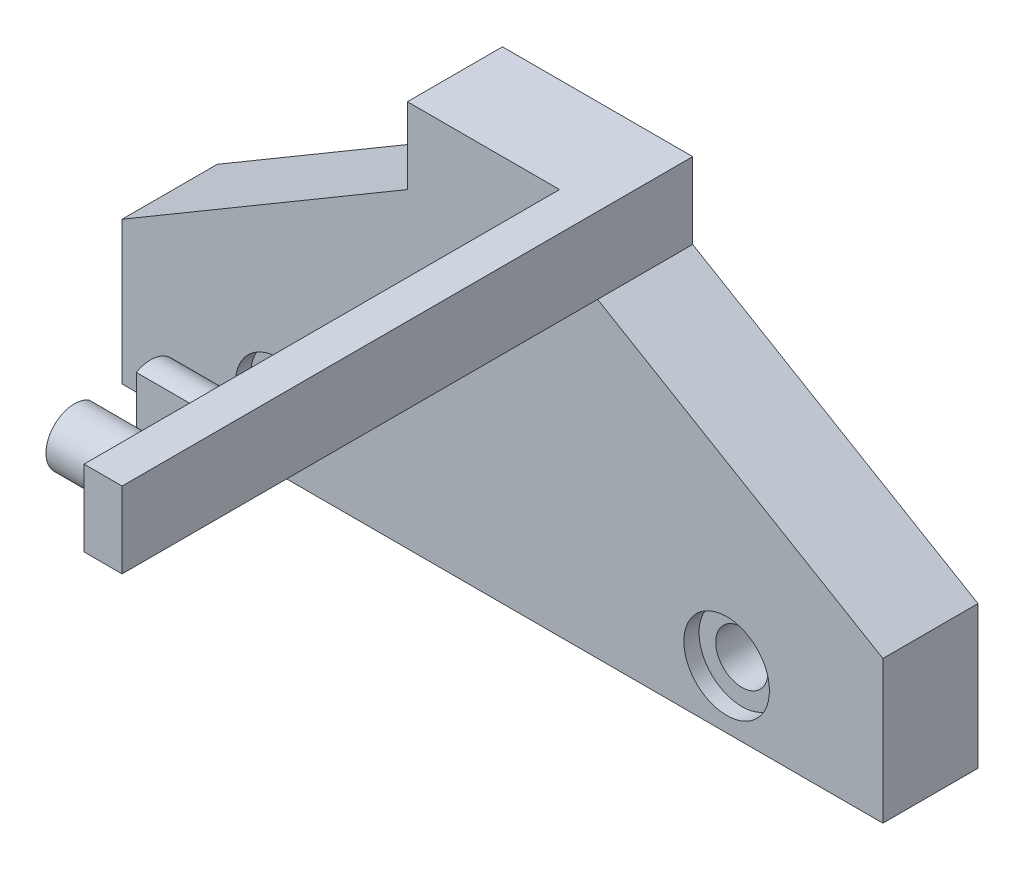
ISO-10303-21;
HEADER;
FILE_DESCRIPTION(('STEP AP214'),'2;1');
FILE_NAME('part.step','',(''),(''),'','','');
FILE_SCHEMA(('AUTOMOTIVE_DESIGN { 1 0 10303 214 1 1 1 1 }'));
ENDSEC;
DATA;
#1=APPLICATION_CONTEXT('core data for automotive mechanical design processes');
#2=APPLICATION_PROTOCOL_DEFINITION('international standard','automotive_design',2000,#1);
#3=PRODUCT_CONTEXT('',#1,'mechanical');
#4=PRODUCT('Part','Part','',(#3));
#5=PRODUCT_RELATED_PRODUCT_CATEGORY('part','',(#4));
#6=PRODUCT_DEFINITION_FORMATION('','',#4);
#7=PRODUCT_DEFINITION_CONTEXT('part definition',#1,'design');
#8=PRODUCT_DEFINITION('design','',#6,#7);
#9=PRODUCT_DEFINITION_SHAPE('','',#8);
#10=(LENGTH_UNIT() NAMED_UNIT(*) SI_UNIT(.MILLI.,.METRE.));
#11=(NAMED_UNIT(*) PLANE_ANGLE_UNIT() SI_UNIT($,.RADIAN.));
#12=(NAMED_UNIT(*) SI_UNIT($,.STERADIAN.) SOLID_ANGLE_UNIT());
#13=UNCERTAINTY_MEASURE_WITH_UNIT(LENGTH_MEASURE(1.E-05),#10,'distance_accuracy_value','');
#14=(GEOMETRIC_REPRESENTATION_CONTEXT(3) GLOBAL_UNCERTAINTY_ASSIGNED_CONTEXT((#13)) GLOBAL_UNIT_ASSIGNED_CONTEXT((#10,
#11,#12)) REPRESENTATION_CONTEXT('',''));
#15=CARTESIAN_POINT('',(0.,0.,0.));
#16=DIRECTION('',(0.,0.,1.));
#17=DIRECTION('',(1.,0.,0.));
#18=AXIS2_PLACEMENT_3D('',#15,#16,#17);
#19=CARTESIAN_POINT('',(-15.3821921783989,26.6400519422906,54.));
#20=DIRECTION('',(1.,0.,0.));
#21=DIRECTION('',(0.,0.,-1.));
#22=AXIS2_PLACEMENT_3D('',#19,#20,#21);
#23=CYLINDRICAL_SURFACE('',#22,3.);
#24=DIRECTION('',(1.,0.,0.));
#25=VECTOR('',#24,1.);
#26=CARTESIAN_POINT('',(-15.3821921783989,29.2381281536439,52.5));
#27=LINE('',#26,#25);
#28=CARTESIAN_POINT('',(-15.3821921783989,29.2381281536439,52.5));
#29=VERTEX_POINT('',#28);
#30=CARTESIAN_POINT('',(-8.38219217839893,29.2381281536439,52.5));
#31=VERTEX_POINT('',#30);
#32=EDGE_CURVE('E263',#29,#31,#27,.T.);
#33=ORIENTED_EDGE('',*,*,#32,.F.);
#34=CARTESIAN_POINT('',(-15.3821921783989,26.6400519422906,54.));
#35=DIRECTION('',(-1.,0.,0.));
#36=DIRECTION('',(0.,0.,1.));
#37=AXIS2_PLACEMENT_3D('',#34,#35,#36);
#38=CIRCLE('',#37,3.);
#39=CARTESIAN_POINT('',(-15.3821921783989,24.0419757309373,52.5));
#40=VERTEX_POINT('',#39);
#41=EDGE_CURVE('E252',#40,#29,#38,.T.);
#42=ORIENTED_EDGE('',*,*,#41,.F.);
#43=DIRECTION('',(1.,0.,0.));
#44=VECTOR('',#43,1.);
#45=CARTESIAN_POINT('',(-15.3821921783989,24.0419757309373,52.5));
#46=LINE('',#45,#44);
#47=CARTESIAN_POINT('',(-8.38219217839893,24.0419757309373,52.5));
#48=VERTEX_POINT('',#47);
#49=EDGE_CURVE('E48',#48,#40,#46,.F.);
#50=ORIENTED_EDGE('',*,*,#49,.F.);
#51=CARTESIAN_POINT('',(-8.38219217839893,26.6400519422906,54.));
#52=DIRECTION('',(1.,0.,0.));
#53=DIRECTION('',(0.,0.,-1.));
#54=AXIS2_PLACEMENT_3D('',#51,#52,#53);
#55=CIRCLE('',#54,3.);
#56=EDGE_CURVE('E152',#48,#31,#55,.F.);
#57=ORIENTED_EDGE('',*,*,#56,.T.);
#58=EDGE_LOOP('',(#33,#42,#50,#57));
#59=FACE_BOUND('',#58,.T.);
#60=ADVANCED_FACE('F33',(#59),#23,.T.);
#61=CARTESIAN_POINT('',(-15.3821921783989,26.6400519422906,54.));
#62=DIRECTION('',(-1.,0.,0.));
#63=DIRECTION('',(0.,0.,1.));
#64=AXIS2_PLACEMENT_3D('',#61,#62,#63);
#65=PLANE('',#64);
#66=ORIENTED_EDGE('',*,*,#41,.T.);
#67=DIRECTION('',(0.,-1.,0.));
#68=VECTOR('',#67,1.);
#69=CARTESIAN_POINT('',(-15.3821921783989,26.6400519422906,52.5));
#70=LINE('',#69,#68);
#71=EDGE_CURVE('E11',#29,#40,#70,.T.);
#72=ORIENTED_EDGE('',*,*,#71,.T.);
#73=EDGE_LOOP('',(#66,#72));
#74=FACE_BOUND('',#73,.T.);
#75=ADVANCED_FACE('F274',(#74),#65,.T.);
#76=CARTESIAN_POINT('',(-15.3821921783989,26.6400519422906,46.));
#77=DIRECTION('',(1.,0.,0.));
#78=DIRECTION('',(0.,0.,-1.));
#79=AXIS2_PLACEMENT_3D('',#76,#77,#78);
#80=CYLINDRICAL_SURFACE('',#79,2.99999999999999);
#81=DIRECTION('',(1.,0.,0.));
#82=VECTOR('',#81,1.);
#83=CARTESIAN_POINT('',(-15.3821921783989,24.0419757309373,47.5));
#84=LINE('',#83,#82);
#85=CARTESIAN_POINT('',(-15.3821921783989,24.0419757309373,47.5));
#86=VERTEX_POINT('',#85);
#87=CARTESIAN_POINT('',(-8.38219217839893,24.0419757309373,47.5));
#88=VERTEX_POINT('',#87);
#89=EDGE_CURVE('E137',#86,#88,#84,.T.);
#90=ORIENTED_EDGE('',*,*,#89,.F.);
#91=CARTESIAN_POINT('',(-15.3821921783989,26.6400519422906,46.));
#92=DIRECTION('',(-1.,0.,0.));
#93=DIRECTION('',(0.,0.,1.));
#94=AXIS2_PLACEMENT_3D('',#91,#92,#93);
#95=CIRCLE('',#94,2.99999999999999);
#96=CARTESIAN_POINT('',(-15.3821921783989,29.2381281536439,47.5));
#97=VERTEX_POINT('',#96);
#98=EDGE_CURVE('E148',#97,#86,#95,.T.);
#99=ORIENTED_EDGE('',*,*,#98,.F.);
#100=DIRECTION('',(1.,0.,0.));
#101=VECTOR('',#100,1.);
#102=CARTESIAN_POINT('',(-15.3821921783989,29.2381281536439,47.5));
#103=LINE('',#102,#101);
#104=CARTESIAN_POINT('',(-8.38219217839893,29.2381281536439,47.5));
#105=VERTEX_POINT('',#104);
#106=EDGE_CURVE('E55',#105,#97,#103,.F.);
#107=ORIENTED_EDGE('',*,*,#106,.F.);
#108=CARTESIAN_POINT('',(-8.38219217839893,26.6400519422906,46.));
#109=DIRECTION('',(1.,0.,0.));
#110=DIRECTION('',(0.,0.,-1.));
#111=AXIS2_PLACEMENT_3D('',#108,#109,#110);
#112=CIRCLE('',#111,2.99999999999999);
#113=EDGE_CURVE('E146',#105,#88,#112,.F.);
#114=ORIENTED_EDGE('',*,*,#113,.T.);
#115=EDGE_LOOP('',(#90,#99,#107,#114));
#116=FACE_BOUND('',#115,.T.);
#117=ADVANCED_FACE('F145',(#116),#80,.T.);
#118=CARTESIAN_POINT('',(-15.3821921783989,26.6400519422906,46.));
#119=DIRECTION('',(-1.,0.,0.));
#120=DIRECTION('',(0.,0.,1.));
#121=AXIS2_PLACEMENT_3D('',#118,#119,#120);
#122=PLANE('',#121);
#123=ORIENTED_EDGE('',*,*,#98,.T.);
#124=DIRECTION('',(0.,1.,0.));
#125=VECTOR('',#124,1.);
#126=CARTESIAN_POINT('',(-15.3821921783989,26.6400519422906,47.5));
#127=LINE('',#126,#125);
#128=EDGE_CURVE('E41',#86,#97,#127,.T.);
#129=ORIENTED_EDGE('',*,*,#128,.T.);
#130=EDGE_LOOP('',(#123,#129));
#131=FACE_BOUND('',#130,.T.);
#132=ADVANCED_FACE('F325',(#131),#122,.T.);
#133=CARTESIAN_POINT('',(-37.9521921783989,-3.95994805770938,0.));
#134=DIRECTION('',(0.,0.,1.));
#135=DIRECTION('',(1.,0.,0.));
#136=AXIS2_PLACEMENT_3D('',#133,#134,#135);
#137=CYLINDRICAL_SURFACE('',#136,2.74999999999999);
#138=CARTESIAN_POINT('',(-37.9521921783989,-3.95994805770938,0.));
#139=DIRECTION('',(0.,0.,1.));
#140=DIRECTION('',(1.,0.,0.));
#141=AXIS2_PLACEMENT_3D('',#138,#139,#140);
#142=CIRCLE('',#141,2.74999999999999);
#143=CARTESIAN_POINT('',(-35.2021921783989,-3.95994805770938,0.));
#144=VERTEX_POINT('',#143);
#145=EDGE_CURVE('E208',#144,#144,#142,.T.);
#146=ORIENTED_EDGE('',*,*,#145,.F.);
#147=EDGE_LOOP('',(#146));
#148=FACE_BOUND('',#147,.T.);
#149=CARTESIAN_POINT('',(-37.9521921783989,-3.95994805770938,8.4));
#150=DIRECTION('',(0.,0.,1.));
#151=DIRECTION('',(1.,0.,0.));
#152=AXIS2_PLACEMENT_3D('',#149,#150,#151);
#153=CIRCLE('',#152,2.74999999999999);
#154=CARTESIAN_POINT('',(-35.2021921783989,-3.95994805770938,8.4));
#155=VERTEX_POINT('',#154);
#156=EDGE_CURVE('E158',#155,#155,#153,.F.);
#157=ORIENTED_EDGE('',*,*,#156,.F.);
#158=EDGE_LOOP('',(#157));
#159=FACE_BOUND('',#158,.T.);
#160=ADVANCED_FACE('F321',(#148,#159),#137,.F.);
#161=CARTESIAN_POINT('',(9.18780782160107,-3.95994805770938,0.));
#162=DIRECTION('',(0.,0.,1.));
#163=DIRECTION('',(1.,0.,0.));
#164=AXIS2_PLACEMENT_3D('',#161,#162,#163);
#165=CYLINDRICAL_SURFACE('',#164,2.74999999999999);
#166=CARTESIAN_POINT('',(9.18780782160107,-3.95994805770938,0.));
#167=DIRECTION('',(0.,0.,-1.));
#168=DIRECTION('',(-1.,0.,0.));
#169=AXIS2_PLACEMENT_3D('',#166,#167,#168);
#170=CIRCLE('',#169,2.74999999999999);
#171=CARTESIAN_POINT('',(6.43780782160108,-3.95994805770938,0.));
#172=VERTEX_POINT('',#171);
#173=EDGE_CURVE('E161',#172,#172,#170,.T.);
#174=ORIENTED_EDGE('',*,*,#173,.T.);
#175=EDGE_LOOP('',(#174));
#176=FACE_BOUND('',#175,.T.);
#177=CARTESIAN_POINT('',(9.18780782160107,-3.95994805770938,8.4));
#178=DIRECTION('',(0.,0.,1.));
#179=DIRECTION('',(1.,0.,0.));
#180=AXIS2_PLACEMENT_3D('',#177,#178,#179);
#181=CIRCLE('',#180,2.74999999999999);
#182=CARTESIAN_POINT('',(11.9378078216011,-3.95994805770938,8.4));
#183=VERTEX_POINT('',#182);
#184=EDGE_CURVE('E162',#183,#183,#181,.T.);
#185=ORIENTED_EDGE('',*,*,#184,.T.);
#186=EDGE_LOOP('',(#185));
#187=FACE_BOUND('',#186,.T.);
#188=ADVANCED_FACE('F318',(#176,#187),#165,.F.);
#189=CARTESIAN_POINT('',(-54.3821921783989,4.94005194229062,10.));
#190=DIRECTION('',(1.,0.,0.));
#191=DIRECTION('',(0.,0.,-1.));
#192=AXIS2_PLACEMENT_3D('',#189,#190,#191);
#193=PLANE('',#192);
#194=DIRECTION('',(0.,-1.,0.));
#195=VECTOR('',#194,1.);
#196=CARTESIAN_POINT('',(-54.3821921783989,4.94005194229062,0.));
#197=LINE('',#196,#195);
#198=CARTESIAN_POINT('',(-54.3821921783989,4.94005194229062,0.));
#199=VERTEX_POINT('',#198);
#200=CARTESIAN_POINT('',(-54.3821921783989,-10.0599480577094,0.));
#201=VERTEX_POINT('',#200);
#202=EDGE_CURVE('E205',#199,#201,#197,.T.);
#203=ORIENTED_EDGE('',*,*,#202,.T.);
#204=DIRECTION('',(0.,0.,-1.));
#205=VECTOR('',#204,1.);
#206=CARTESIAN_POINT('',(-54.3821921783989,-10.0599480577094,10.));
#207=LINE('',#206,#205);
#208=CARTESIAN_POINT('',(-54.3821921783989,-10.0599480577094,10.));
#209=VERTEX_POINT('',#208);
#210=EDGE_CURVE('E155',#209,#201,#207,.T.);
#211=ORIENTED_EDGE('',*,*,#210,.F.);
#212=DIRECTION('',(0.,-1.,0.));
#213=VECTOR('',#212,1.);
#214=CARTESIAN_POINT('',(-54.3821921783989,4.94005194229062,10.));
#215=LINE('',#214,#213);
#216=CARTESIAN_POINT('',(-54.3821921783989,4.94005194229062,10.));
#217=VERTEX_POINT('',#216);
#218=EDGE_CURVE('E192',#217,#209,#215,.T.);
#219=ORIENTED_EDGE('',*,*,#218,.F.);
#220=DIRECTION('',(0.,0.,-1.));
#221=VECTOR('',#220,1.);
#222=CARTESIAN_POINT('',(-54.3821921783989,4.94005194229062,10.));
#223=LINE('',#222,#221);
#224=EDGE_CURVE('E186',#217,#199,#223,.T.);
#225=ORIENTED_EDGE('',*,*,#224,.T.);
#226=EDGE_LOOP('',(#203,#211,#219,#225));
#227=FACE_BOUND('',#226,.T.);
#228=ADVANCED_FACE('F35',(#227),#193,.F.);
#229=CARTESIAN_POINT('',(-54.3821921783989,-10.0599480577094,10.));
#230=DIRECTION('',(0.,1.,0.));
#231=DIRECTION('',(-1.,0.,0.));
#232=AXIS2_PLACEMENT_3D('',#229,#230,#231);
#233=PLANE('',#232);
#234=DIRECTION('',(1.,0.,0.));
#235=VECTOR('',#234,1.);
#236=CARTESIAN_POINT('',(-54.3821921783989,-10.0599480577094,0.));
#237=LINE('',#236,#235);
#238=CARTESIAN_POINT('',(25.6178078216011,-10.0599480577094,0.));
#239=VERTEX_POINT('',#238);
#240=EDGE_CURVE('E203',#201,#239,#237,.T.);
#241=ORIENTED_EDGE('',*,*,#240,.T.);
#242=DIRECTION('',(0.,0.,-1.));
#243=VECTOR('',#242,1.);
#244=CARTESIAN_POINT('',(25.6178078216011,-10.0599480577094,10.));
#245=LINE('',#244,#243);
#246=CARTESIAN_POINT('',(25.6178078216011,-10.0599480577094,10.));
#247=VERTEX_POINT('',#246);
#248=EDGE_CURVE('E168',#247,#239,#245,.T.);
#249=ORIENTED_EDGE('',*,*,#248,.F.);
#250=DIRECTION('',(1.,0.,0.));
#251=VECTOR('',#250,1.);
#252=CARTESIAN_POINT('',(-54.3821921783989,-10.0599480577094,10.));
#253=LINE('',#252,#251);
#254=EDGE_CURVE('E218',#209,#247,#253,.T.);
#255=ORIENTED_EDGE('',*,*,#254,.F.);
#256=ORIENTED_EDGE('',*,*,#210,.T.);
#257=EDGE_LOOP('',(#241,#249,#255,#256));
#258=FACE_BOUND('',#257,.T.);
#259=ADVANCED_FACE('F356',(#258),#233,.F.);
#260=CARTESIAN_POINT('',(25.6178078216011,4.94005194229062,10.));
#261=DIRECTION('',(-1.,0.,0.));
#262=DIRECTION('',(0.,0.,1.));
#263=AXIS2_PLACEMENT_3D('',#260,#261,#262);
#264=PLANE('',#263);
#265=DIRECTION('',(0.,1.,0.));
#266=VECTOR('',#265,1.);
#267=CARTESIAN_POINT('',(25.6178078216011,4.94005194229062,0.));
#268=LINE('',#267,#266);
#269=CARTESIAN_POINT('',(25.6178078216011,4.94005194229062,0.));
#270=VERTEX_POINT('',#269);
#271=EDGE_CURVE('E201',#239,#270,#268,.T.);
#272=ORIENTED_EDGE('',*,*,#271,.T.);
#273=DIRECTION('',(0.,0.,-1.));
#274=VECTOR('',#273,1.);
#275=CARTESIAN_POINT('',(25.6178078216011,4.94005194229062,10.));
#276=LINE('',#275,#274);
#277=CARTESIAN_POINT('',(25.6178078216011,4.94005194229062,10.));
#278=VERTEX_POINT('',#277);
#279=EDGE_CURVE('E171',#278,#270,#276,.T.);
#280=ORIENTED_EDGE('',*,*,#279,.F.);
#281=DIRECTION('',(0.,1.,0.));
#282=VECTOR('',#281,1.);
#283=CARTESIAN_POINT('',(25.6178078216011,4.94005194229062,10.));
#284=LINE('',#283,#282);
#285=EDGE_CURVE('E216',#247,#278,#284,.T.);
#286=ORIENTED_EDGE('',*,*,#285,.F.);
#287=ORIENTED_EDGE('',*,*,#248,.T.);
#288=EDGE_LOOP('',(#272,#280,#286,#287));
#289=FACE_BOUND('',#288,.T.);
#290=ADVANCED_FACE('F353',(#289),#264,.F.);
#291=CARTESIAN_POINT('',(-4.38219217839893,22.6400519422906,10.));
#292=DIRECTION('',(-0.508148861978286,-0.861269257590315,0.));
#293=DIRECTION('',(0.861269257590315,-0.508148861978286,0.));
#294=AXIS2_PLACEMENT_3D('',#291,#292,#293);
#295=PLANE('',#294);
#296=DIRECTION('',(-0.861269257590315,0.508148861978286,0.));
#297=VECTOR('',#296,1.);
#298=CARTESIAN_POINT('',(-4.38219217839893,22.6400519422906,0.));
#299=LINE('',#298,#297);
#300=CARTESIAN_POINT('',(-4.38219217839893,22.6400519422906,0.));
#301=VERTEX_POINT('',#300);
#302=EDGE_CURVE('E199',#270,#301,#299,.T.);
#303=ORIENTED_EDGE('',*,*,#302,.T.);
#304=DIRECTION('',(0.,0.,-1.));
#305=VECTOR('',#304,1.);
#306=CARTESIAN_POINT('',(-4.38219217839893,22.6400519422906,10.));
#307=LINE('',#306,#305);
#308=CARTESIAN_POINT('',(-4.38219217839893,22.6400519422906,10.));
#309=VERTEX_POINT('',#308);
#310=EDGE_CURVE('E174',#309,#301,#307,.T.);
#311=ORIENTED_EDGE('',*,*,#310,.F.);
#312=DIRECTION('',(-0.861269257590315,0.508148861978286,0.));
#313=VECTOR('',#312,1.);
#314=CARTESIAN_POINT('',(-4.38219217839893,22.6400519422906,10.));
#315=LINE('',#314,#313);
#316=EDGE_CURVE('E214',#278,#309,#315,.T.);
#317=ORIENTED_EDGE('',*,*,#316,.F.);
#318=ORIENTED_EDGE('',*,*,#279,.T.);
#319=EDGE_LOOP('',(#303,#311,#317,#318));
#320=FACE_BOUND('',#319,.T.);
#321=ADVANCED_FACE('F349',(#320),#295,.F.);
#322=CARTESIAN_POINT('',(-4.38219217839893,30.6400519422906,10.));
#323=DIRECTION('',(-1.,0.,0.));
#324=DIRECTION('',(0.,0.,1.));
#325=AXIS2_PLACEMENT_3D('',#322,#323,#324);
#326=PLANE('',#325);
#327=DIRECTION('',(0.,1.,0.));
#328=VECTOR('',#327,1.);
#329=CARTESIAN_POINT('',(-4.38219217839893,30.6400519422906,0.));
#330=LINE('',#329,#328);
#331=CARTESIAN_POINT('',(-4.38219217839893,30.6400519422906,0.));
#332=VERTEX_POINT('',#331);
#333=EDGE_CURVE('E197',#301,#332,#330,.T.);
#334=ORIENTED_EDGE('',*,*,#333,.T.);
#335=DIRECTION('',(0.,0.,-1.));
#336=VECTOR('',#335,1.);
#337=CARTESIAN_POINT('',(-4.38219217839893,30.6400519422906,10.));
#338=LINE('',#337,#336);
#339=CARTESIAN_POINT('',(-4.38219217839893,30.6400519422906,60.));
#340=VERTEX_POINT('',#339);
#341=EDGE_CURVE('E177',#340,#332,#338,.T.);
#342=ORIENTED_EDGE('',*,*,#341,.F.);
#343=DIRECTION('',(0.,1.,0.));
#344=VECTOR('',#343,1.);
#345=CARTESIAN_POINT('',(-4.38219217839893,22.6400519422906,60.));
#346=LINE('',#345,#344);
#347=CARTESIAN_POINT('',(-4.38219217839893,22.6400519422906,60.));
#348=VERTEX_POINT('',#347);
#349=EDGE_CURVE('E248',#348,#340,#346,.T.);
#350=ORIENTED_EDGE('',*,*,#349,.F.);
#351=DIRECTION('',(0.,0.,-1.));
#352=VECTOR('',#351,1.);
#353=CARTESIAN_POINT('',(-4.38219217839893,22.6400519422906,60.));
#354=LINE('',#353,#352);
#355=EDGE_CURVE('E241',#348,#309,#354,.T.);
#356=ORIENTED_EDGE('',*,*,#355,.T.);
#357=ORIENTED_EDGE('',*,*,#310,.T.);
#358=EDGE_LOOP('',(#334,#342,#350,#356,#357));
#359=FACE_BOUND('',#358,.T.);
#360=ADVANCED_FACE('F345',(#359),#326,.F.);
#361=CARTESIAN_POINT('',(-24.3821921783989,30.6400519422906,10.));
#362=DIRECTION('',(0.,-1.,0.));
#363=DIRECTION('',(0.,0.,-1.));
#364=AXIS2_PLACEMENT_3D('',#361,#362,#363);
#365=PLANE('',#364);
#366=DIRECTION('',(-1.,0.,0.));
#367=VECTOR('',#366,1.);
#368=CARTESIAN_POINT('',(-24.3821921783989,30.6400519422906,0.));
#369=LINE('',#368,#367);
#370=CARTESIAN_POINT('',(-24.3821921783989,30.6400519422906,0.));
#371=VERTEX_POINT('',#370);
#372=EDGE_CURVE('E195',#332,#371,#369,.T.);
#373=ORIENTED_EDGE('',*,*,#372,.T.);
#374=DIRECTION('',(0.,0.,-1.));
#375=VECTOR('',#374,1.);
#376=CARTESIAN_POINT('',(-24.3821921783989,30.6400519422906,10.));
#377=LINE('',#376,#375);
#378=CARTESIAN_POINT('',(-24.3821921783989,30.6400519422906,10.));
#379=VERTEX_POINT('',#378);
#380=EDGE_CURVE('E180',#379,#371,#377,.T.);
#381=ORIENTED_EDGE('',*,*,#380,.F.);
#382=DIRECTION('',(-1.,0.,0.));
#383=VECTOR('',#382,1.);
#384=CARTESIAN_POINT('',(-24.3821921783989,30.6400519422906,10.));
#385=LINE('',#384,#383);
#386=CARTESIAN_POINT('',(-8.38219217839893,30.6400519422906,10.));
#387=VERTEX_POINT('',#386);
#388=EDGE_CURVE('E212',#387,#379,#385,.T.);
#389=ORIENTED_EDGE('',*,*,#388,.F.);
#390=DIRECTION('',(0.,0.,-1.));
#391=VECTOR('',#390,1.);
#392=CARTESIAN_POINT('',(-8.38219217839893,30.6400519422906,60.));
#393=LINE('',#392,#391);
#394=CARTESIAN_POINT('',(-8.38219217839893,30.6400519422906,60.));
#395=VERTEX_POINT('',#394);
#396=EDGE_CURVE('E230',#395,#387,#393,.T.);
#397=ORIENTED_EDGE('',*,*,#396,.F.);
#398=DIRECTION('',(-1.,0.,0.));
#399=VECTOR('',#398,1.);
#400=CARTESIAN_POINT('',(-4.38219217839893,30.6400519422906,60.));
#401=LINE('',#400,#399);
#402=EDGE_CURVE('E256',#340,#395,#401,.T.);
#403=ORIENTED_EDGE('',*,*,#402,.F.);
#404=ORIENTED_EDGE('',*,*,#341,.T.);
#405=EDGE_LOOP('',(#373,#381,#389,#397,#403,#404));
#406=FACE_BOUND('',#405,.T.);
#407=ADVANCED_FACE('F341',(#406),#365,.F.);
#408=CARTESIAN_POINT('',(-24.3821921783989,30.6400519422906,10.));
#409=DIRECTION('',(1.,0.,0.));
#410=DIRECTION('',(0.,0.,-1.));
#411=AXIS2_PLACEMENT_3D('',#408,#409,#410);
#412=PLANE('',#411);
#413=DIRECTION('',(0.,-1.,0.));
#414=VECTOR('',#413,1.);
#415=CARTESIAN_POINT('',(-24.3821921783989,30.6400519422906,0.));
#416=LINE('',#415,#414);
#417=CARTESIAN_POINT('',(-24.3821921783989,22.6400519422906,0.));
#418=VERTEX_POINT('',#417);
#419=EDGE_CURVE('E193',#371,#418,#416,.T.);
#420=ORIENTED_EDGE('',*,*,#419,.T.);
#421=DIRECTION('',(0.,0.,-1.));
#422=VECTOR('',#421,1.);
#423=CARTESIAN_POINT('',(-24.3821921783989,22.6400519422906,10.));
#424=LINE('',#423,#422);
#425=CARTESIAN_POINT('',(-24.3821921783989,22.6400519422906,10.));
#426=VERTEX_POINT('',#425);
#427=EDGE_CURVE('E183',#426,#418,#424,.T.);
#428=ORIENTED_EDGE('',*,*,#427,.F.);
#429=DIRECTION('',(0.,-1.,0.));
#430=VECTOR('',#429,1.);
#431=CARTESIAN_POINT('',(-24.3821921783989,30.6400519422906,10.));
#432=LINE('',#431,#430);
#433=EDGE_CURVE('E210',#379,#426,#432,.T.);
#434=ORIENTED_EDGE('',*,*,#433,.F.);
#435=ORIENTED_EDGE('',*,*,#380,.T.);
#436=EDGE_LOOP('',(#420,#428,#434,#435));
#437=FACE_BOUND('',#436,.T.);
#438=ADVANCED_FACE('F337',(#437),#412,.F.);
#439=CARTESIAN_POINT('',(-24.3821921783989,22.6400519422906,10.));
#440=DIRECTION('',(0.508148861978286,-0.861269257590315,0.));
#441=DIRECTION('',(0.861269257590315,0.508148861978286,0.));
#442=AXIS2_PLACEMENT_3D('',#439,#440,#441);
#443=PLANE('',#442);
#444=DIRECTION('',(-0.861269257590315,-0.508148861978286,0.));
#445=VECTOR('',#444,1.);
#446=CARTESIAN_POINT('',(-24.3821921783989,22.6400519422906,0.));
#447=LINE('',#446,#445);
#448=EDGE_CURVE('E190',#418,#199,#447,.T.);
#449=ORIENTED_EDGE('',*,*,#448,.T.);
#450=ORIENTED_EDGE('',*,*,#224,.F.);
#451=DIRECTION('',(-0.861269257590315,-0.508148861978286,0.));
#452=VECTOR('',#451,1.);
#453=CARTESIAN_POINT('',(-24.3821921783989,22.6400519422906,10.));
#454=LINE('',#453,#452);
#455=EDGE_CURVE('E189',#426,#217,#454,.T.);
#456=ORIENTED_EDGE('',*,*,#455,.F.);
#457=ORIENTED_EDGE('',*,*,#427,.T.);
#458=EDGE_LOOP('',(#449,#450,#456,#457));
#459=FACE_BOUND('',#458,.T.);
#460=ADVANCED_FACE('F330',(#459),#443,.F.);
#461=CARTESIAN_POINT('',(0.,0.,10.));
#462=DIRECTION('',(0.,0.,1.));
#463=DIRECTION('',(1.,0.,0.));
#464=AXIS2_PLACEMENT_3D('',#461,#462,#463);
#465=PLANE('',#464);
#466=DIRECTION('',(1.,0.,0.));
#467=VECTOR('',#466,1.);
#468=CARTESIAN_POINT('',(-4.38219217839893,22.6400519422906,10.));
#469=LINE('',#468,#467);
#470=CARTESIAN_POINT('',(-8.38219217839893,22.6400519422906,10.));
#471=VERTEX_POINT('',#470);
#472=EDGE_CURVE('E245',#471,#309,#469,.T.);
#473=ORIENTED_EDGE('',*,*,#472,.F.);
#474=DIRECTION('',(0.,-1.,0.));
#475=VECTOR('',#474,1.);
#476=CARTESIAN_POINT('',(-8.38219217839893,22.6400519422906,10.));
#477=LINE('',#476,#475);
#478=EDGE_CURVE('E249',#387,#471,#477,.T.);
#479=ORIENTED_EDGE('',*,*,#478,.F.);
#480=ORIENTED_EDGE('',*,*,#388,.T.);
#481=ORIENTED_EDGE('',*,*,#433,.T.);
#482=ORIENTED_EDGE('',*,*,#455,.T.);
#483=ORIENTED_EDGE('',*,*,#218,.T.);
#484=ORIENTED_EDGE('',*,*,#254,.T.);
#485=ORIENTED_EDGE('',*,*,#285,.T.);
#486=ORIENTED_EDGE('',*,*,#316,.T.);
#487=EDGE_LOOP('',(#473,#479,#480,#481,#482,#483,#484,#485,#486));
#488=FACE_BOUND('',#487,.T.);
#489=CARTESIAN_POINT('',(-37.9521921783989,-3.95994805770938,10.));
#490=DIRECTION('',(0.,0.,1.));
#491=DIRECTION('',(1.,0.,0.));
#492=AXIS2_PLACEMENT_3D('',#489,#490,#491);
#493=CIRCLE('',#492,4.5);
#494=CARTESIAN_POINT('',(-33.4521921783989,-3.95994805770938,10.));
#495=VERTEX_POINT('',#494);
#496=EDGE_CURVE('E233',#495,#495,#493,.T.);
#497=ORIENTED_EDGE('',*,*,#496,.F.);
#498=EDGE_LOOP('',(#497));
#499=FACE_BOUND('',#498,.T.);
#500=CARTESIAN_POINT('',(9.18780782160107,-3.95994805770938,10.));
#501=DIRECTION('',(0.,0.,1.));
#502=DIRECTION('',(1.,0.,0.));
#503=AXIS2_PLACEMENT_3D('',#500,#501,#502);
#504=CIRCLE('',#503,4.5);
#505=CARTESIAN_POINT('',(13.6878078216011,-3.95994805770938,10.));
#506=VERTEX_POINT('',#505);
#507=EDGE_CURVE('E226',#506,#506,#504,.T.);
#508=ORIENTED_EDGE('',*,*,#507,.F.);
#509=EDGE_LOOP('',(#508));
#510=FACE_BOUND('',#509,.T.);
#511=ADVANCED_FACE('F327',(#488,#499,#510),#465,.T.);
#512=CARTESIAN_POINT('',(0.,0.,0.));
#513=DIRECTION('',(0.,0.,1.));
#514=DIRECTION('',(1.,0.,0.));
#515=AXIS2_PLACEMENT_3D('',#512,#513,#514);
#516=PLANE('',#515);
#517=ORIENTED_EDGE('',*,*,#173,.F.);
#518=EDGE_LOOP('',(#517));
#519=FACE_BOUND('',#518,.T.);
#520=ORIENTED_EDGE('',*,*,#145,.T.);
#521=EDGE_LOOP('',(#520));
#522=FACE_BOUND('',#521,.T.);
#523=ORIENTED_EDGE('',*,*,#202,.F.);
#524=ORIENTED_EDGE('',*,*,#448,.F.);
#525=ORIENTED_EDGE('',*,*,#419,.F.);
#526=ORIENTED_EDGE('',*,*,#372,.F.);
#527=ORIENTED_EDGE('',*,*,#333,.F.);
#528=ORIENTED_EDGE('',*,*,#302,.F.);
#529=ORIENTED_EDGE('',*,*,#271,.F.);
#530=ORIENTED_EDGE('',*,*,#240,.F.);
#531=EDGE_LOOP('',(#523,#524,#525,#526,#527,#528,#529,#530));
#532=FACE_BOUND('',#531,.T.);
#533=ADVANCED_FACE('F316',(#519,#522,#532),#516,.F.);
#534=CARTESIAN_POINT('',(9.18780782160107,-3.95994805770938,8.4));
#535=DIRECTION('',(0.,0.,1.));
#536=DIRECTION('',(1.,0.,0.));
#537=AXIS2_PLACEMENT_3D('',#534,#535,#536);
#538=CYLINDRICAL_SURFACE('',#537,4.5);
#539=CARTESIAN_POINT('',(9.18780782160107,-3.95994805770938,8.4));
#540=DIRECTION('',(0.,0.,1.));
#541=DIRECTION('',(1.,0.,0.));
#542=AXIS2_PLACEMENT_3D('',#539,#540,#541);
#543=CIRCLE('',#542,4.5);
#544=CARTESIAN_POINT('',(13.6878078216011,-3.95994805770938,8.4));
#545=VERTEX_POINT('',#544);
#546=EDGE_CURVE('E229',#545,#545,#543,.T.);
#547=ORIENTED_EDGE('',*,*,#546,.F.);
#548=EDGE_LOOP('',(#547));
#549=FACE_BOUND('',#548,.T.);
#550=ORIENTED_EDGE('',*,*,#507,.T.);
#551=EDGE_LOOP('',(#550));
#552=FACE_BOUND('',#551,.T.);
#553=ADVANCED_FACE('F312',(#549,#552),#538,.F.);
#554=CARTESIAN_POINT('',(9.18780782160107,-3.95994805770938,8.4));
#555=DIRECTION('',(0.,0.,1.));
#556=DIRECTION('',(1.,0.,0.));
#557=AXIS2_PLACEMENT_3D('',#554,#555,#556);
#558=PLANE('',#557);
#559=ORIENTED_EDGE('',*,*,#184,.F.);
#560=EDGE_LOOP('',(#559));
#561=FACE_BOUND('',#560,.T.);
#562=ORIENTED_EDGE('',*,*,#546,.T.);
#563=EDGE_LOOP('',(#562));
#564=FACE_BOUND('',#563,.T.);
#565=ADVANCED_FACE('F305',(#561,#564),#558,.T.);
#566=CARTESIAN_POINT('',(-37.9521921783989,-3.95994805770938,8.4));
#567=DIRECTION('',(0.,0.,1.));
#568=DIRECTION('',(1.,0.,0.));
#569=AXIS2_PLACEMENT_3D('',#566,#567,#568);
#570=PLANE('',#569);
#571=CARTESIAN_POINT('',(-37.9521921783989,-3.95994805770938,8.4));
#572=DIRECTION('',(0.,0.,1.));
#573=DIRECTION('',(1.,0.,0.));
#574=AXIS2_PLACEMENT_3D('',#571,#572,#573);
#575=CIRCLE('',#574,4.5);
#576=CARTESIAN_POINT('',(-33.4521921783989,-3.95994805770938,8.4));
#577=VERTEX_POINT('',#576);
#578=EDGE_CURVE('E165',#577,#577,#575,.T.);
#579=ORIENTED_EDGE('',*,*,#578,.T.);
#580=EDGE_LOOP('',(#579));
#581=FACE_BOUND('',#580,.T.);
#582=ORIENTED_EDGE('',*,*,#156,.T.);
#583=EDGE_LOOP('',(#582));
#584=FACE_BOUND('',#583,.T.);
#585=ADVANCED_FACE('F302',(#581,#584),#570,.T.);
#586=CARTESIAN_POINT('',(-37.9521921783989,-3.95994805770938,8.4));
#587=DIRECTION('',(0.,0.,1.));
#588=DIRECTION('',(1.,0.,0.));
#589=AXIS2_PLACEMENT_3D('',#586,#587,#588);
#590=CYLINDRICAL_SURFACE('',#589,4.5);
#591=ORIENTED_EDGE('',*,*,#578,.F.);
#592=EDGE_LOOP('',(#591));
#593=FACE_BOUND('',#592,.T.);
#594=ORIENTED_EDGE('',*,*,#496,.T.);
#595=EDGE_LOOP('',(#594));
#596=FACE_BOUND('',#595,.T.);
#597=ADVANCED_FACE('F301',(#593,#596),#590,.F.);
#598=CARTESIAN_POINT('',(-8.38219217839893,22.6400519422906,60.));
#599=DIRECTION('',(1.,0.,0.));
#600=DIRECTION('',(0.,0.,-1.));
#601=AXIS2_PLACEMENT_3D('',#598,#599,#600);
#602=PLANE('',#601);
#603=ORIENTED_EDGE('',*,*,#56,.F.);
#604=DIRECTION('',(0.,1.,0.));
#605=VECTOR('',#604,1.);
#606=CARTESIAN_POINT('',(-8.38219217839893,22.6400519422906,52.5));
#607=LINE('',#606,#605);
#608=EDGE_CURVE('E141',#48,#31,#607,.T.);
#609=ORIENTED_EDGE('',*,*,#608,.T.);
#610=EDGE_LOOP('',(#603,#609));
#611=FACE_BOUND('',#610,.T.);
#612=ORIENTED_EDGE('',*,*,#113,.F.);
#613=DIRECTION('',(0.,-1.,0.));
#614=VECTOR('',#613,1.);
#615=CARTESIAN_POINT('',(-8.38219217839893,22.6400519422906,47.5));
#616=LINE('',#615,#614);
#617=EDGE_CURVE('E134',#105,#88,#616,.T.);
#618=ORIENTED_EDGE('',*,*,#617,.T.);
#619=EDGE_LOOP('',(#612,#618));
#620=FACE_BOUND('',#619,.T.);
#621=ORIENTED_EDGE('',*,*,#478,.T.);
#622=DIRECTION('',(0.,0.,-1.));
#623=VECTOR('',#622,1.);
#624=CARTESIAN_POINT('',(-8.38219217839893,22.6400519422906,60.));
#625=LINE('',#624,#623);
#626=CARTESIAN_POINT('',(-8.38219217839893,22.6400519422906,60.));
#627=VERTEX_POINT('',#626);
#628=EDGE_CURVE('E239',#627,#471,#625,.T.);
#629=ORIENTED_EDGE('',*,*,#628,.F.);
#630=DIRECTION('',(0.,-1.,0.));
#631=VECTOR('',#630,1.);
#632=CARTESIAN_POINT('',(-8.38219217839893,22.6400519422906,60.));
#633=LINE('',#632,#631);
#634=EDGE_CURVE('E254',#395,#627,#633,.T.);
#635=ORIENTED_EDGE('',*,*,#634,.F.);
#636=ORIENTED_EDGE('',*,*,#396,.T.);
#637=EDGE_LOOP('',(#621,#629,#635,#636));
#638=FACE_BOUND('',#637,.T.);
#639=ADVANCED_FACE('F150',(#611,#620,#638),#602,.F.);
#640=CARTESIAN_POINT('',(-4.38219217839893,22.6400519422906,60.));
#641=DIRECTION('',(0.,1.,0.));
#642=DIRECTION('',(0.,0.,1.));
#643=AXIS2_PLACEMENT_3D('',#640,#641,#642);
#644=PLANE('',#643);
#645=ORIENTED_EDGE('',*,*,#472,.T.);
#646=ORIENTED_EDGE('',*,*,#355,.F.);
#647=DIRECTION('',(1.,0.,0.));
#648=VECTOR('',#647,1.);
#649=CARTESIAN_POINT('',(-4.38219217839893,22.6400519422906,60.));
#650=LINE('',#649,#648);
#651=EDGE_CURVE('E244',#627,#348,#650,.T.);
#652=ORIENTED_EDGE('',*,*,#651,.F.);
#653=ORIENTED_EDGE('',*,*,#628,.T.);
#654=EDGE_LOOP('',(#645,#646,#652,#653));
#655=FACE_BOUND('',#654,.T.);
#656=ADVANCED_FACE('F294',(#655),#644,.F.);
#657=CARTESIAN_POINT('',(0.,0.,60.));
#658=DIRECTION('',(0.,0.,1.));
#659=DIRECTION('',(1.,0.,0.));
#660=AXIS2_PLACEMENT_3D('',#657,#658,#659);
#661=PLANE('',#660);
#662=ORIENTED_EDGE('',*,*,#349,.T.);
#663=ORIENTED_EDGE('',*,*,#402,.T.);
#664=ORIENTED_EDGE('',*,*,#634,.T.);
#665=ORIENTED_EDGE('',*,*,#651,.T.);
#666=EDGE_LOOP('',(#662,#663,#664,#665));
#667=FACE_BOUND('',#666,.T.);
#668=ADVANCED_FACE('F281',(#667),#661,.T.);
#669=CARTESIAN_POINT('',(-54.3821921783989,22.6400519422906,47.5));
#670=DIRECTION('',(0.,0.,1.));
#671=DIRECTION('',(0.,-1.,0.));
#672=AXIS2_PLACEMENT_3D('',#669,#670,#671);
#673=PLANE('',#672);
#674=ORIENTED_EDGE('',*,*,#89,.T.);
#675=ORIENTED_EDGE('',*,*,#617,.F.);
#676=ORIENTED_EDGE('',*,*,#106,.T.);
#677=ORIENTED_EDGE('',*,*,#128,.F.);
#678=EDGE_LOOP('',(#674,#675,#676,#677));
#679=FACE_BOUND('',#678,.T.);
#680=ADVANCED_FACE('F135',(#679),#673,.T.);
#681=CARTESIAN_POINT('',(-54.3821921783989,22.6400519422906,52.5));
#682=DIRECTION('',(0.,0.,-1.));
#683=DIRECTION('',(-1.,0.,0.));
#684=AXIS2_PLACEMENT_3D('',#681,#682,#683);
#685=PLANE('',#684);
#686=ORIENTED_EDGE('',*,*,#32,.T.);
#687=ORIENTED_EDGE('',*,*,#608,.F.);
#688=ORIENTED_EDGE('',*,*,#49,.T.);
#689=ORIENTED_EDGE('',*,*,#71,.F.);
#690=EDGE_LOOP('',(#686,#687,#688,#689));
#691=FACE_BOUND('',#690,.T.);
#692=ADVANCED_FACE('F275',(#691),#685,.T.);
#693=CLOSED_SHELL('',(#60,#75,#117,#132,#160,#188,#228,#259,#290,#321,#360,#407,#438,#460,#511,
#533,#553,#565,#585,#597,#639,#656,#668,#680,#692));
#694=MANIFOLD_SOLID_BREP('B2',#693);
#695=ADVANCED_BREP_SHAPE_REPRESENTATION('',(#18,#694),#14);
#696=SHAPE_DEFINITION_REPRESENTATION(#9,#695);
ENDSEC;
END-ISO-10303-21;
